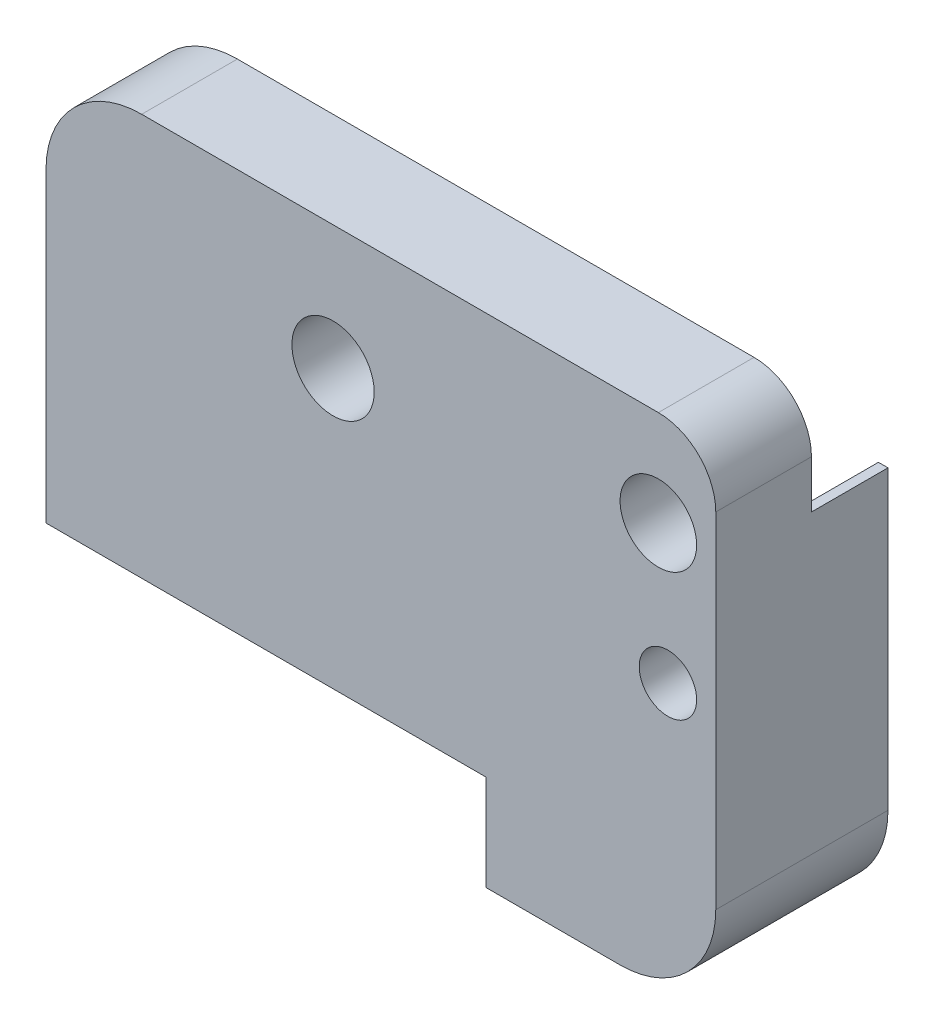
ISO-10303-21;
HEADER;
FILE_DESCRIPTION(('STEP AP214'),'2;1');
FILE_NAME('part.step','',(''),(''),'','','');
FILE_SCHEMA(('AUTOMOTIVE_DESIGN { 1 0 10303 214 1 1 1 1 }'));
ENDSEC;
DATA;
#1=APPLICATION_CONTEXT('core data for automotive mechanical design processes');
#2=APPLICATION_PROTOCOL_DEFINITION('international standard','automotive_design',2000,#1);
#3=PRODUCT_CONTEXT('',#1,'mechanical');
#4=PRODUCT('Part','Part','',(#3));
#5=PRODUCT_RELATED_PRODUCT_CATEGORY('part','',(#4));
#6=PRODUCT_DEFINITION_FORMATION('','',#4);
#7=PRODUCT_DEFINITION_CONTEXT('part definition',#1,'design');
#8=PRODUCT_DEFINITION('design','',#6,#7);
#9=PRODUCT_DEFINITION_SHAPE('','',#8);
#10=(LENGTH_UNIT() NAMED_UNIT(*) SI_UNIT(.MILLI.,.METRE.));
#11=(NAMED_UNIT(*) PLANE_ANGLE_UNIT() SI_UNIT($,.RADIAN.));
#12=(NAMED_UNIT(*) SI_UNIT($,.STERADIAN.) SOLID_ANGLE_UNIT());
#13=UNCERTAINTY_MEASURE_WITH_UNIT(LENGTH_MEASURE(1.E-05),#10,'distance_accuracy_value','');
#14=(GEOMETRIC_REPRESENTATION_CONTEXT(3) GLOBAL_UNCERTAINTY_ASSIGNED_CONTEXT((#13)) GLOBAL_UNIT_ASSIGNED_CONTEXT((#10,
#11,#12)) REPRESENTATION_CONTEXT('',''));
#15=CARTESIAN_POINT('',(0.,0.,0.));
#16=DIRECTION('',(0.,0.,1.));
#17=DIRECTION('',(1.,0.,0.));
#18=AXIS2_PLACEMENT_3D('',#15,#16,#17);
#19=CARTESIAN_POINT('',(-15.,-14.5,0.));
#20=DIRECTION('',(0.,0.,1.));
#21=DIRECTION('',(1.,0.,0.));
#22=AXIS2_PLACEMENT_3D('',#19,#20,#21);
#23=PLANE('',#22);
#24=CARTESIAN_POINT('',(17.5,-5.5,0.));
#25=DIRECTION('',(0.,0.,1.));
#26=DIRECTION('',(1.,0.,0.));
#27=AXIS2_PLACEMENT_3D('',#24,#25,#26);
#28=CIRCLE('',#27,2.);
#29=CARTESIAN_POINT('',(19.5,-5.5,0.));
#30=VERTEX_POINT('',#29);
#31=CARTESIAN_POINT('',(17.5,-7.5,0.));
#32=VERTEX_POINT('',#31);
#33=EDGE_CURVE('E208',#30,#32,#28,.F.);
#34=ORIENTED_EDGE('',*,*,#33,.T.);
#35=CARTESIAN_POINT('',(17.5,-5.5,0.));
#36=DIRECTION('',(0.,0.,1.));
#37=DIRECTION('',(1.,0.,0.));
#38=AXIS2_PLACEMENT_3D('',#35,#36,#37);
#39=CIRCLE('',#38,2.);
#40=CARTESIAN_POINT('',(15.5,-5.5,0.));
#41=VERTEX_POINT('',#40);
#42=EDGE_CURVE('E210',#32,#41,#39,.F.);
#43=ORIENTED_EDGE('',*,*,#42,.T.);
#44=DIRECTION('',(0.,1.,0.));
#45=VECTOR('',#44,1.);
#46=CARTESIAN_POINT('',(15.5,-7.5,0.));
#47=LINE('',#46,#45);
#48=CARTESIAN_POINT('',(15.5,-0.949192546583853,0.));
#49=VERTEX_POINT('',#48);
#50=EDGE_CURVE('E220',#41,#49,#47,.T.);
#51=ORIENTED_EDGE('',*,*,#50,.T.);
#52=DIRECTION('',(0.8001192566292,0.599840958230711,0.));
#53=VECTOR('',#52,1.);
#54=CARTESIAN_POINT('',(18.1,1.,0.));
#55=LINE('',#54,#53);
#56=CARTESIAN_POINT('',(2.,-11.07,0.));
#57=VERTEX_POINT('',#56);
#58=EDGE_CURVE('E190',#57,#49,#55,.T.);
#59=ORIENTED_EDGE('',*,*,#58,.F.);
#60=DIRECTION('',(0.,1.,0.));
#61=VECTOR('',#60,1.);
#62=CARTESIAN_POINT('',(2.,-11.07,0.));
#63=LINE('',#62,#61);
#64=CARTESIAN_POINT('',(2.,-14.5,0.));
#65=VERTEX_POINT('',#64);
#66=EDGE_CURVE('E194',#65,#57,#63,.T.);
#67=ORIENTED_EDGE('',*,*,#66,.F.);
#68=DIRECTION('',(1.,0.,0.));
#69=VECTOR('',#68,1.);
#70=CARTESIAN_POINT('',(-15.,-14.5,0.));
#71=LINE('',#70,#69);
#72=CARTESIAN_POINT('',(-15.,-14.5,0.));
#73=VERTEX_POINT('',#72);
#74=EDGE_CURVE('E256',#73,#65,#71,.T.);
#75=ORIENTED_EDGE('',*,*,#74,.F.);
#76=DIRECTION('',(0.,-1.,0.));
#77=VECTOR('',#76,1.);
#78=CARTESIAN_POINT('',(-15.,6.5,0.));
#79=LINE('',#78,#77);
#80=CARTESIAN_POINT('',(-15.,1.5,0.));
#81=VERTEX_POINT('',#80);
#82=EDGE_CURVE('E265',#81,#73,#79,.T.);
#83=ORIENTED_EDGE('',*,*,#82,.F.);
#84=CARTESIAN_POINT('',(-10.,1.5,0.));
#85=DIRECTION('',(0.,0.,1.));
#86=DIRECTION('',(1.,0.,0.));
#87=AXIS2_PLACEMENT_3D('',#84,#85,#86);
#88=CIRCLE('',#87,5.);
#89=CARTESIAN_POINT('',(-10.,6.5,0.));
#90=VERTEX_POINT('',#89);
#91=EDGE_CURVE('E293',#81,#90,#88,.F.);
#92=ORIENTED_EDGE('',*,*,#91,.T.);
#93=DIRECTION('',(-1.,0.,0.));
#94=VECTOR('',#93,1.);
#95=CARTESIAN_POINT('',(-15.,6.5,0.));
#96=LINE('',#95,#94);
#97=CARTESIAN_POINT('',(17.,6.5,0.));
#98=VERTEX_POINT('',#97);
#99=EDGE_CURVE('E264',#98,#90,#96,.T.);
#100=ORIENTED_EDGE('',*,*,#99,.F.);
#101=CARTESIAN_POINT('',(17.,3.5,0.));
#102=DIRECTION('',(0.,0.,1.));
#103=DIRECTION('',(1.,0.,0.));
#104=AXIS2_PLACEMENT_3D('',#101,#102,#103);
#105=CIRCLE('',#104,3.);
#106=CARTESIAN_POINT('',(20.,3.5,0.));
#107=VERTEX_POINT('',#106);
#108=EDGE_CURVE('E340',#98,#107,#105,.F.);
#109=ORIENTED_EDGE('',*,*,#108,.T.);
#110=DIRECTION('',(0.,-1.,0.));
#111=VECTOR('',#110,1.);
#112=CARTESIAN_POINT('',(20.,6.5,0.));
#113=LINE('',#112,#111);
#114=CARTESIAN_POINT('',(20.,1.,0.));
#115=VERTEX_POINT('',#114);
#116=EDGE_CURVE('E343',#107,#115,#113,.T.);
#117=ORIENTED_EDGE('',*,*,#116,.T.);
#118=DIRECTION('',(1.,0.,0.));
#119=VECTOR('',#118,1.);
#120=CARTESIAN_POINT('',(20.,1.,0.));
#121=LINE('',#120,#119);
#122=CARTESIAN_POINT('',(19.5,1.,0.));
#123=VERTEX_POINT('',#122);
#124=EDGE_CURVE('E193',#123,#115,#121,.T.);
#125=ORIENTED_EDGE('',*,*,#124,.F.);
#126=DIRECTION('',(0.,-1.,0.));
#127=VECTOR('',#126,1.);
#128=CARTESIAN_POINT('',(19.5,1.,0.));
#129=LINE('',#128,#127);
#130=EDGE_CURVE('E162',#123,#30,#129,.T.);
#131=ORIENTED_EDGE('',*,*,#130,.T.);
#132=EDGE_LOOP('',(#34,#43,#51,#59,#67,#75,#83,#92,#100,#109,#117,#125,#131));
#133=FACE_BOUND('',#132,.T.);
#134=CARTESIAN_POINT('',(-4.9,-6.5,0.));
#135=DIRECTION('',(0.,0.,-1.));
#136=DIRECTION('',(-1.,0.,0.));
#137=AXIS2_PLACEMENT_3D('',#134,#135,#136);
#138=CIRCLE('',#137,4.5);
#139=CARTESIAN_POINT('',(-9.4,-6.5,0.));
#140=VERTEX_POINT('',#139);
#141=EDGE_CURVE('E366',#140,#140,#138,.T.);
#142=ORIENTED_EDGE('',*,*,#141,.F.);
#143=EDGE_LOOP('',(#142));
#144=FACE_BOUND('',#143,.T.);
#145=CARTESIAN_POINT('',(17.5,-5.5,0.));
#146=DIRECTION('',(0.,0.,1.));
#147=DIRECTION('',(1.,0.,0.));
#148=AXIS2_PLACEMENT_3D('',#145,#146,#147);
#149=CIRCLE('',#148,1.5);
#150=CARTESIAN_POINT('',(19.,-5.5,0.));
#151=VERTEX_POINT('',#150);
#152=EDGE_CURVE('E166',#151,#151,#149,.F.);
#153=ORIENTED_EDGE('',*,*,#152,.F.);
#154=EDGE_LOOP('',(#153));
#155=FACE_BOUND('',#154,.T.);
#156=ADVANCED_FACE('F36',(#133,#144,#155),#23,.F.);
#157=CARTESIAN_POINT('',(-15.,6.5,5.));
#158=DIRECTION('',(1.,0.,0.));
#159=DIRECTION('',(0.,1.,0.));
#160=AXIS2_PLACEMENT_3D('',#157,#158,#159);
#161=PLANE('',#160);
#162=DIRECTION('',(0.,-1.,0.));
#163=VECTOR('',#162,1.);
#164=CARTESIAN_POINT('',(-15.,6.5,5.));
#165=LINE('',#164,#163);
#166=CARTESIAN_POINT('',(-15.,1.5,5.));
#167=VERTEX_POINT('',#166);
#168=CARTESIAN_POINT('',(-15.,-14.5,5.));
#169=VERTEX_POINT('',#168);
#170=EDGE_CURVE('E318',#167,#169,#165,.T.);
#171=ORIENTED_EDGE('',*,*,#170,.F.);
#172=DIRECTION('',(0.,0.,-1.));
#173=VECTOR('',#172,1.);
#174=CARTESIAN_POINT('',(-15.,1.5,5.));
#175=LINE('',#174,#173);
#176=EDGE_CURVE('E291',#167,#81,#175,.T.);
#177=ORIENTED_EDGE('',*,*,#176,.T.);
#178=ORIENTED_EDGE('',*,*,#82,.T.);
#179=DIRECTION('',(0.,0.,-1.));
#180=VECTOR('',#179,1.);
#181=CARTESIAN_POINT('',(-15.,-14.5,5.));
#182=LINE('',#181,#180);
#183=EDGE_CURVE('E263',#169,#73,#182,.T.);
#184=ORIENTED_EDGE('',*,*,#183,.F.);
#185=EDGE_LOOP('',(#171,#177,#178,#184));
#186=FACE_BOUND('',#185,.T.);
#187=ADVANCED_FACE('F317',(#186),#161,.F.);
#188=CARTESIAN_POINT('',(-15.,-14.5,5.));
#189=DIRECTION('',(0.,1.,0.));
#190=DIRECTION('',(0.,0.,1.));
#191=AXIS2_PLACEMENT_3D('',#188,#189,#190);
#192=PLANE('',#191);
#193=CARTESIAN_POINT('',(1.40000000000001,-14.5,2.5));
#194=DIRECTION('',(0.,-1.,0.));
#195=DIRECTION('',(0.,0.,-1.));
#196=AXIS2_PLACEMENT_3D('',#193,#194,#195);
#197=CIRCLE('',#196,1.25);
#198=CARTESIAN_POINT('',(1.40000000000001,-14.5,1.25));
#199=VERTEX_POINT('',#198);
#200=EDGE_CURVE('E345',#199,#199,#197,.T.);
#201=ORIENTED_EDGE('',*,*,#200,.F.);
#202=EDGE_LOOP('',(#201));
#203=FACE_BOUND('',#202,.T.);
#204=CARTESIAN_POINT('',(-12.,-14.5,2.5));
#205=DIRECTION('',(0.,-1.,0.));
#206=DIRECTION('',(0.,0.,-1.));
#207=AXIS2_PLACEMENT_3D('',#204,#205,#206);
#208=CIRCLE('',#207,1.25);
#209=CARTESIAN_POINT('',(-12.,-14.5,1.25));
#210=VERTEX_POINT('',#209);
#211=EDGE_CURVE('E363',#210,#210,#208,.T.);
#212=ORIENTED_EDGE('',*,*,#211,.F.);
#213=EDGE_LOOP('',(#212));
#214=FACE_BOUND('',#213,.T.);
#215=ORIENTED_EDGE('',*,*,#74,.T.);
#216=DIRECTION('',(0.,0.,1.));
#217=VECTOR('',#216,1.);
#218=CARTESIAN_POINT('',(2.,-14.5,-4.));
#219=LINE('',#218,#217);
#220=CARTESIAN_POINT('',(2.,-14.5,-4.));
#221=VERTEX_POINT('',#220);
#222=EDGE_CURVE('E251',#221,#65,#219,.T.);
#223=ORIENTED_EDGE('',*,*,#222,.F.);
#224=DIRECTION('',(-1.,0.,0.));
#225=VECTOR('',#224,1.);
#226=CARTESIAN_POINT('',(2.,-14.5,-4.));
#227=LINE('',#226,#225);
#228=CARTESIAN_POINT('',(8.,-14.5,-4.));
#229=VERTEX_POINT('',#228);
#230=EDGE_CURVE('E239',#229,#221,#227,.T.);
#231=ORIENTED_EDGE('',*,*,#230,.F.);
#232=DIRECTION('',(0.,0.,-1.));
#233=VECTOR('',#232,1.);
#234=CARTESIAN_POINT('',(8.00000000000001,-14.5,5.));
#235=LINE('',#234,#233);
#236=CARTESIAN_POINT('',(8.00000000000001,-14.5,5.));
#237=VERTEX_POINT('',#236);
#238=EDGE_CURVE('E311',#237,#229,#235,.T.);
#239=ORIENTED_EDGE('',*,*,#238,.F.);
#240=DIRECTION('',(1.,0.,0.));
#241=VECTOR('',#240,1.);
#242=CARTESIAN_POINT('',(-15.,-14.5,5.));
#243=LINE('',#242,#241);
#244=EDGE_CURVE('E312',#169,#237,#243,.T.);
#245=ORIENTED_EDGE('',*,*,#244,.F.);
#246=ORIENTED_EDGE('',*,*,#183,.T.);
#247=EDGE_LOOP('',(#215,#223,#231,#239,#245,#246));
#248=FACE_BOUND('',#247,.T.);
#249=ADVANCED_FACE('F260',(#203,#214,#248),#192,.F.);
#250=CARTESIAN_POINT('',(-15.,6.5,5.));
#251=DIRECTION('',(0.,-1.,0.));
#252=DIRECTION('',(0.,0.,-1.));
#253=AXIS2_PLACEMENT_3D('',#250,#251,#252);
#254=PLANE('',#253);
#255=ORIENTED_EDGE('',*,*,#99,.T.);
#256=DIRECTION('',(0.,0.,-1.));
#257=VECTOR('',#256,1.);
#258=CARTESIAN_POINT('',(-10.,6.5,5.));
#259=LINE('',#258,#257);
#260=CARTESIAN_POINT('',(-10.,6.5,5.));
#261=VERTEX_POINT('',#260);
#262=EDGE_CURVE('E203',#90,#261,#259,.F.);
#263=ORIENTED_EDGE('',*,*,#262,.T.);
#264=DIRECTION('',(-1.,0.,0.));
#265=VECTOR('',#264,1.);
#266=CARTESIAN_POINT('',(-15.,6.5,5.));
#267=LINE('',#266,#265);
#268=CARTESIAN_POINT('',(17.,6.5,5.));
#269=VERTEX_POINT('',#268);
#270=EDGE_CURVE('E301',#269,#261,#267,.T.);
#271=ORIENTED_EDGE('',*,*,#270,.F.);
#272=DIRECTION('',(0.,0.,1.));
#273=VECTOR('',#272,1.);
#274=CARTESIAN_POINT('',(17.,6.5,0.));
#275=LINE('',#274,#273);
#276=EDGE_CURVE('E283',#269,#98,#275,.F.);
#277=ORIENTED_EDGE('',*,*,#276,.T.);
#278=EDGE_LOOP('',(#255,#263,#271,#277));
#279=FACE_BOUND('',#278,.T.);
#280=ADVANCED_FACE('F300',(#279),#254,.F.);
#281=CARTESIAN_POINT('',(-15.,-14.5,5.));
#282=DIRECTION('',(0.,0.,1.));
#283=DIRECTION('',(1.,0.,0.));
#284=AXIS2_PLACEMENT_3D('',#281,#282,#283);
#285=PLANE('',#284);
#286=CARTESIAN_POINT('',(17.5,-5.5,5.));
#287=DIRECTION('',(0.,0.,1.));
#288=DIRECTION('',(1.,0.,0.));
#289=AXIS2_PLACEMENT_3D('',#286,#287,#288);
#290=CIRCLE('',#289,1.5);
#291=CARTESIAN_POINT('',(19.,-5.5,5.));
#292=VERTEX_POINT('',#291);
#293=EDGE_CURVE('E469',#292,#292,#290,.T.);
#294=ORIENTED_EDGE('',*,*,#293,.F.);
#295=EDGE_LOOP('',(#294));
#296=FACE_BOUND('',#295,.T.);
#297=CARTESIAN_POINT('',(17.,1.5,5.));
#298=DIRECTION('',(0.,0.,1.));
#299=DIRECTION('',(1.,0.,0.));
#300=AXIS2_PLACEMENT_3D('',#297,#298,#299);
#301=CIRCLE('',#300,2.);
#302=CARTESIAN_POINT('',(19.,1.5,5.));
#303=VERTEX_POINT('',#302);
#304=EDGE_CURVE('E350',#303,#303,#301,.T.);
#305=ORIENTED_EDGE('',*,*,#304,.F.);
#306=EDGE_LOOP('',(#305));
#307=FACE_BOUND('',#306,.T.);
#308=CARTESIAN_POINT('',(0.,0.,5.));
#309=DIRECTION('',(0.,0.,1.));
#310=DIRECTION('',(1.,0.,0.));
#311=AXIS2_PLACEMENT_3D('',#308,#309,#310);
#312=CIRCLE('',#311,2.15);
#313=CARTESIAN_POINT('',(2.15,0.,5.));
#314=VERTEX_POINT('',#313);
#315=EDGE_CURVE('E322',#314,#314,#312,.T.);
#316=ORIENTED_EDGE('',*,*,#315,.F.);
#317=EDGE_LOOP('',(#316));
#318=FACE_BOUND('',#317,.T.);
#319=DIRECTION('',(1.,0.,0.));
#320=VECTOR('',#319,1.);
#321=CARTESIAN_POINT('',(8.,-19.5,5.));
#322=LINE('',#321,#320);
#323=CARTESIAN_POINT('',(8.,-19.5,5.));
#324=VERTEX_POINT('',#323);
#325=CARTESIAN_POINT('',(15.,-19.5,5.));
#326=VERTEX_POINT('',#325);
#327=EDGE_CURVE('E354',#324,#326,#322,.T.);
#328=ORIENTED_EDGE('',*,*,#327,.T.);
#329=CARTESIAN_POINT('',(15.,-14.5,5.));
#330=DIRECTION('',(0.,0.,1.));
#331=DIRECTION('',(1.,0.,0.));
#332=AXIS2_PLACEMENT_3D('',#329,#330,#331);
#333=CIRCLE('',#332,5.);
#334=CARTESIAN_POINT('',(20.,-14.5,5.));
#335=VERTEX_POINT('',#334);
#336=EDGE_CURVE('E285',#326,#335,#333,.T.);
#337=ORIENTED_EDGE('',*,*,#336,.T.);
#338=DIRECTION('',(0.,1.,0.));
#339=VECTOR('',#338,1.);
#340=CARTESIAN_POINT('',(20.,6.5,5.));
#341=LINE('',#340,#339);
#342=CARTESIAN_POINT('',(20.,3.5,5.));
#343=VERTEX_POINT('',#342);
#344=EDGE_CURVE('E383',#335,#343,#341,.T.);
#345=ORIENTED_EDGE('',*,*,#344,.T.);
#346=CARTESIAN_POINT('',(17.,3.5,5.));
#347=DIRECTION('',(0.,0.,1.));
#348=DIRECTION('',(1.,0.,0.));
#349=AXIS2_PLACEMENT_3D('',#346,#347,#348);
#350=CIRCLE('',#349,3.);
#351=EDGE_CURVE('E310',#343,#269,#350,.T.);
#352=ORIENTED_EDGE('',*,*,#351,.T.);
#353=ORIENTED_EDGE('',*,*,#270,.T.);
#354=CARTESIAN_POINT('',(-10.,1.5,5.));
#355=DIRECTION('',(0.,0.,1.));
#356=DIRECTION('',(1.,0.,0.));
#357=AXIS2_PLACEMENT_3D('',#354,#355,#356);
#358=CIRCLE('',#357,5.);
#359=EDGE_CURVE('E282',#261,#167,#358,.T.);
#360=ORIENTED_EDGE('',*,*,#359,.T.);
#361=ORIENTED_EDGE('',*,*,#170,.T.);
#362=ORIENTED_EDGE('',*,*,#244,.T.);
#363=DIRECTION('',(0.,-1.,0.));
#364=VECTOR('',#363,1.);
#365=CARTESIAN_POINT('',(8.,6.5,5.));
#366=LINE('',#365,#364);
#367=EDGE_CURVE('E357',#237,#324,#366,.T.);
#368=ORIENTED_EDGE('',*,*,#367,.T.);
#369=EDGE_LOOP('',(#328,#337,#345,#352,#353,#360,#361,#362,#368));
#370=FACE_BOUND('',#369,.T.);
#371=ADVANCED_FACE('F307',(#296,#307,#318,#370),#285,.T.);
#372=CARTESIAN_POINT('',(0.,0.,0.7));
#373=DIRECTION('',(0.,0.,1.));
#374=DIRECTION('',(1.,0.,0.));
#375=AXIS2_PLACEMENT_3D('',#372,#373,#374);
#376=CYLINDRICAL_SURFACE('',#375,2.15);
#377=CARTESIAN_POINT('',(0.,0.,0.7));
#378=DIRECTION('',(0.,0.,1.));
#379=DIRECTION('',(1.,0.,0.));
#380=AXIS2_PLACEMENT_3D('',#377,#378,#379);
#381=CIRCLE('',#380,2.15);
#382=CARTESIAN_POINT('',(2.15,0.,0.7));
#383=VERTEX_POINT('',#382);
#384=EDGE_CURVE('E319',#383,#383,#381,.T.);
#385=CARTESIAN_POINT('',(2.15,0.,0.7));
#386=CARTESIAN_POINT('',(2.15,0.,0.744791666666667));
#387=CARTESIAN_POINT('',(2.15,0.,0.789583333333333));
#388=CARTESIAN_POINT('',(2.15,0.,0.879166666666667));
#389=CARTESIAN_POINT('',(2.15,0.,0.923958333333333));
#390=CARTESIAN_POINT('',(2.15,0.,1.01354166666667));
#391=CARTESIAN_POINT('',(2.15,0.,1.05833333333333));
#392=CARTESIAN_POINT('',(2.15,0.,1.14791666666667));
#393=CARTESIAN_POINT('',(2.15,0.,1.19270833333333));
#394=CARTESIAN_POINT('',(2.15,0.,1.28229166666667));
#395=CARTESIAN_POINT('',(2.15,0.,1.32708333333333));
#396=CARTESIAN_POINT('',(2.15,0.,1.41666666666667));
#397=CARTESIAN_POINT('',(2.15,0.,1.46145833333333));
#398=CARTESIAN_POINT('',(2.15,0.,1.55104166666667));
#399=CARTESIAN_POINT('',(2.15,0.,1.59583333333333));
#400=CARTESIAN_POINT('',(2.15,0.,1.68541666666667));
#401=CARTESIAN_POINT('',(2.15,0.,1.73020833333333));
#402=CARTESIAN_POINT('',(2.15,0.,1.81979166666667));
#403=CARTESIAN_POINT('',(2.15,0.,1.86458333333333));
#404=CARTESIAN_POINT('',(2.15,0.,1.95416666666667));
#405=CARTESIAN_POINT('',(2.15,0.,1.99895833333333));
#406=CARTESIAN_POINT('',(2.15,0.,2.08854166666667));
#407=CARTESIAN_POINT('',(2.15,0.,2.13333333333333));
#408=CARTESIAN_POINT('',(2.15,0.,2.22291666666667));
#409=CARTESIAN_POINT('',(2.15,0.,2.26770833333333));
#410=CARTESIAN_POINT('',(2.15,0.,2.35729166666667));
#411=CARTESIAN_POINT('',(2.15,0.,2.40208333333333));
#412=CARTESIAN_POINT('',(2.15,0.,2.49166666666667));
#413=CARTESIAN_POINT('',(2.15,0.,2.53645833333333));
#414=CARTESIAN_POINT('',(2.15,0.,2.62604166666667));
#415=CARTESIAN_POINT('',(2.15,0.,2.67083333333333));
#416=CARTESIAN_POINT('',(2.15,0.,2.76041666666667));
#417=CARTESIAN_POINT('',(2.15,0.,2.80520833333333));
#418=CARTESIAN_POINT('',(2.15,0.,2.89479166666667));
#419=CARTESIAN_POINT('',(2.15,0.,2.93958333333333));
#420=CARTESIAN_POINT('',(2.15,0.,3.02916666666667));
#421=CARTESIAN_POINT('',(2.15,0.,3.07395833333333));
#422=CARTESIAN_POINT('',(2.15,0.,3.16354166666667));
#423=CARTESIAN_POINT('',(2.15,0.,3.20833333333333));
#424=CARTESIAN_POINT('',(2.15,0.,3.29791666666667));
#425=CARTESIAN_POINT('',(2.15,0.,3.34270833333333));
#426=CARTESIAN_POINT('',(2.15,0.,3.43229166666667));
#427=CARTESIAN_POINT('',(2.15,0.,3.47708333333333));
#428=CARTESIAN_POINT('',(2.15,0.,3.56666666666667));
#429=CARTESIAN_POINT('',(2.15,0.,3.61145833333333));
#430=CARTESIAN_POINT('',(2.15,0.,3.70104166666667));
#431=CARTESIAN_POINT('',(2.15,0.,3.74583333333333));
#432=CARTESIAN_POINT('',(2.15,0.,3.83541666666667));
#433=CARTESIAN_POINT('',(2.15,0.,3.88020833333333));
#434=CARTESIAN_POINT('',(2.15,0.,3.96979166666667));
#435=CARTESIAN_POINT('',(2.15,0.,4.01458333333333));
#436=CARTESIAN_POINT('',(2.15,0.,4.10416666666667));
#437=CARTESIAN_POINT('',(2.15,0.,4.14895833333333));
#438=CARTESIAN_POINT('',(2.15,0.,4.23854166666667));
#439=CARTESIAN_POINT('',(2.15,0.,4.28333333333333));
#440=CARTESIAN_POINT('',(2.15,0.,4.37291666666667));
#441=CARTESIAN_POINT('',(2.15,0.,4.41770833333333));
#442=CARTESIAN_POINT('',(2.15,0.,4.50729166666667));
#443=CARTESIAN_POINT('',(2.15,0.,4.55208333333333));
#444=CARTESIAN_POINT('',(2.15,0.,4.64166666666667));
#445=CARTESIAN_POINT('',(2.15,0.,4.68645833333333));
#446=CARTESIAN_POINT('',(2.15,0.,4.77604166666667));
#447=CARTESIAN_POINT('',(2.15,0.,4.82083333333333));
#448=CARTESIAN_POINT('',(2.15,0.,4.91041666666667));
#449=CARTESIAN_POINT('',(2.15,0.,4.95520833333333));
#450=CARTESIAN_POINT('',(2.15,0.,5.));
#451=B_SPLINE_CURVE_WITH_KNOTS('',3,(#385,#386,#387,#388,#389,#390,#391,#392,#393,#394,#395,
#396,#397,#398,#399,#400,#401,#402,#403,#404,#405,#406,#407,#408,#409,#410,#411,#412,#413,#414,
#415,#416,#417,#418,#419,#420,#421,#422,#423,#424,#425,#426,#427,#428,#429,#430,#431,#432,#433,
#434,#435,#436,#437,#438,#439,#440,#441,#442,#443,#444,#445,#446,#447,#448,#449,#450),
.UNSPECIFIED.,.F.,.F.,(4,2,2,2,2,2,2,2,2,2,2,2,2,2,2,2,2,2,2,2,2,2,2,2,2,2,2,2,2,2,2,2,4),(0.,
0.134375,0.26875,0.403125,0.5375,0.671875,0.80625,0.940625,1.075,1.209375,1.34375,1.478125,
1.6125,1.746875,1.88125,2.015625,2.15,2.284375,2.41875,2.553125,2.6875,2.821875,2.95625,
3.090625,3.225,3.359375,3.49375,3.628125,3.7625,3.896875,4.03125,4.165625,4.3),.UNSPECIFIED.);
#452=EDGE_CURVE('BSEAM503',#383,#314,#451,.T.);
#453=ORIENTED_EDGE('',*,*,#384,.F.);
#454=ORIENTED_EDGE('',*,*,#315,.T.);
#455=ORIENTED_EDGE('',*,*,#452,.T.);
#456=ORIENTED_EDGE('',*,*,#452,.F.);
#457=EDGE_LOOP('',(#453,#455,#454,#456));
#458=FACE_BOUND('',#457,.T.);
#459=ADVANCED_FACE('F503',(#458),#376,.F.);
#460=CARTESIAN_POINT('',(0.,0.,0.7));
#461=DIRECTION('',(0.,0.,1.));
#462=DIRECTION('',(1.,0.,0.));
#463=AXIS2_PLACEMENT_3D('',#460,#461,#462);
#464=PLANE('',#463);
#465=ORIENTED_EDGE('',*,*,#384,.T.);
#466=EDGE_LOOP('',(#465));
#467=FACE_BOUND('',#466,.T.);
#468=ADVANCED_FACE('F500',(#467),#464,.T.);
#469=CARTESIAN_POINT('',(-4.9,-6.5,4.5));
#470=DIRECTION('',(0.,0.,-1.));
#471=DIRECTION('',(-1.,0.,0.));
#472=AXIS2_PLACEMENT_3D('',#469,#470,#471);
#473=CYLINDRICAL_SURFACE('',#472,4.5);
#474=CARTESIAN_POINT('',(-4.9,-6.5,4.5));
#475=DIRECTION('',(0.,0.,-1.));
#476=DIRECTION('',(-1.,0.,0.));
#477=AXIS2_PLACEMENT_3D('',#474,#475,#476);
#478=CIRCLE('',#477,4.5);
#479=CARTESIAN_POINT('',(-9.4,-6.5,4.5));
#480=VERTEX_POINT('',#479);
#481=EDGE_CURVE('E367',#480,#480,#478,.T.);
#482=ORIENTED_EDGE('',*,*,#481,.F.);
#483=EDGE_LOOP('',(#482));
#484=FACE_BOUND('',#483,.T.);
#485=ORIENTED_EDGE('',*,*,#141,.T.);
#486=EDGE_LOOP('',(#485));
#487=FACE_BOUND('',#486,.T.);
#488=ADVANCED_FACE('F493',(#484,#487),#473,.F.);
#489=CARTESIAN_POINT('',(-4.9,-6.5,4.5));
#490=DIRECTION('',(0.,0.,-1.));
#491=DIRECTION('',(-1.,0.,0.));
#492=AXIS2_PLACEMENT_3D('',#489,#490,#491);
#493=PLANE('',#492);
#494=ORIENTED_EDGE('',*,*,#481,.T.);
#495=EDGE_LOOP('',(#494));
#496=FACE_BOUND('',#495,.T.);
#497=ADVANCED_FACE('F487',(#496),#493,.T.);
#498=CARTESIAN_POINT('',(-12.,-6.5,2.5));
#499=DIRECTION('',(0.,-1.,0.));
#500=DIRECTION('',(0.,0.,-1.));
#501=AXIS2_PLACEMENT_3D('',#498,#499,#500);
#502=CYLINDRICAL_SURFACE('',#501,1.25);
#503=CARTESIAN_POINT('',(-12.,-6.50000000000001,2.5));
#504=DIRECTION('',(0.,-1.,0.));
#505=DIRECTION('',(0.,0.,-1.));
#506=AXIS2_PLACEMENT_3D('',#503,#504,#505);
#507=CIRCLE('',#506,1.24999999999999);
#508=CARTESIAN_POINT('',(-12.,-6.50000000000001,1.25000000000001));
#509=VERTEX_POINT('',#508);
#510=EDGE_CURVE('E267',#509,#509,#507,.T.);
#511=ORIENTED_EDGE('',*,*,#510,.F.);
#512=EDGE_LOOP('',(#511));
#513=FACE_BOUND('',#512,.T.);
#514=ORIENTED_EDGE('',*,*,#211,.T.);
#515=EDGE_LOOP('',(#514));
#516=FACE_BOUND('',#515,.T.);
#517=ADVANCED_FACE('F480',(#513,#516),#502,.F.);
#518=CARTESIAN_POINT('',(1.40000000000001,-6.5,2.5));
#519=DIRECTION('',(0.,-1.,0.));
#520=DIRECTION('',(0.,0.,-1.));
#521=AXIS2_PLACEMENT_3D('',#518,#519,#520);
#522=CYLINDRICAL_SURFACE('',#521,1.25);
#523=CARTESIAN_POINT('',(1.40000000000001,-6.50000000000001,2.5));
#524=DIRECTION('',(0.,-1.,0.));
#525=DIRECTION('',(0.,0.,-1.));
#526=AXIS2_PLACEMENT_3D('',#523,#524,#525);
#527=CIRCLE('',#526,1.24999999999999);
#528=CARTESIAN_POINT('',(1.40000000000001,-6.50000000000001,1.25000000000001));
#529=VERTEX_POINT('',#528);
#530=EDGE_CURVE('E270',#529,#529,#527,.T.);
#531=ORIENTED_EDGE('',*,*,#530,.F.);
#532=EDGE_LOOP('',(#531));
#533=FACE_BOUND('',#532,.T.);
#534=ORIENTED_EDGE('',*,*,#200,.T.);
#535=EDGE_LOOP('',(#534));
#536=FACE_BOUND('',#535,.T.);
#537=ADVANCED_FACE('F477',(#533,#536),#522,.F.);
#538=CARTESIAN_POINT('',(8.,6.5,-28.6356421265527));
#539=DIRECTION('',(-1.,0.,0.));
#540=DIRECTION('',(0.,-1.,0.));
#541=AXIS2_PLACEMENT_3D('',#538,#539,#540);
#542=PLANE('',#541);
#543=ORIENTED_EDGE('',*,*,#367,.F.);
#544=ORIENTED_EDGE('',*,*,#238,.T.);
#545=DIRECTION('',(0.,1.,0.));
#546=VECTOR('',#545,1.);
#547=CARTESIAN_POINT('',(8.,-14.5,-4.));
#548=LINE('',#547,#546);
#549=CARTESIAN_POINT('',(8.,-19.5,-4.));
#550=VERTEX_POINT('',#549);
#551=EDGE_CURVE('E202',#550,#229,#548,.T.);
#552=ORIENTED_EDGE('',*,*,#551,.F.);
#553=DIRECTION('',(0.,0.,1.));
#554=VECTOR('',#553,1.);
#555=CARTESIAN_POINT('',(8.,-19.5,-28.6356421265527));
#556=LINE('',#555,#554);
#557=EDGE_CURVE('E346',#550,#324,#556,.T.);
#558=ORIENTED_EDGE('',*,*,#557,.T.);
#559=EDGE_LOOP('',(#543,#544,#552,#558));
#560=FACE_BOUND('',#559,.T.);
#561=ADVANCED_FACE('F378',(#560),#542,.T.);
#562=CARTESIAN_POINT('',(20.,6.5,-28.6356421265527));
#563=DIRECTION('',(1.,0.,0.));
#564=DIRECTION('',(0.,1.,0.));
#565=AXIS2_PLACEMENT_3D('',#562,#563,#564);
#566=PLANE('',#565);
#567=ORIENTED_EDGE('',*,*,#344,.F.);
#568=DIRECTION('',(0.,0.,1.));
#569=VECTOR('',#568,1.);
#570=CARTESIAN_POINT('',(20.,-14.5,-28.6356421265527));
#571=LINE('',#570,#569);
#572=CARTESIAN_POINT('',(20.,-14.5,-4.));
#573=VERTEX_POINT('',#572);
#574=EDGE_CURVE('E287',#335,#573,#571,.F.);
#575=ORIENTED_EDGE('',*,*,#574,.T.);
#576=DIRECTION('',(0.,-1.,0.));
#577=VECTOR('',#576,1.);
#578=CARTESIAN_POINT('',(20.,-19.5,-4.));
#579=LINE('',#578,#577);
#580=CARTESIAN_POINT('',(20.,1.,-4.));
#581=VERTEX_POINT('',#580);
#582=EDGE_CURVE('E179',#581,#573,#579,.T.);
#583=ORIENTED_EDGE('',*,*,#582,.F.);
#584=DIRECTION('',(0.,0.,1.));
#585=VECTOR('',#584,1.);
#586=CARTESIAN_POINT('',(20.,1.,-4.));
#587=LINE('',#586,#585);
#588=EDGE_CURVE('E177',#581,#115,#587,.T.);
#589=ORIENTED_EDGE('',*,*,#588,.T.);
#590=ORIENTED_EDGE('',*,*,#116,.F.);
#591=DIRECTION('',(0.,0.,1.));
#592=VECTOR('',#591,1.);
#593=CARTESIAN_POINT('',(20.,3.5,5.));
#594=LINE('',#593,#592);
#595=EDGE_CURVE('E337',#107,#343,#594,.T.);
#596=ORIENTED_EDGE('',*,*,#595,.T.);
#597=EDGE_LOOP('',(#567,#575,#583,#589,#590,#596));
#598=FACE_BOUND('',#597,.T.);
#599=ADVANCED_FACE('F391',(#598),#566,.T.);
#600=CARTESIAN_POINT('',(8.,-19.5,-28.6356421265527));
#601=DIRECTION('',(0.,-1.,0.));
#602=DIRECTION('',(0.,0.,-1.));
#603=AXIS2_PLACEMENT_3D('',#600,#601,#602);
#604=PLANE('',#603);
#605=DIRECTION('',(-1.,0.,0.));
#606=VECTOR('',#605,1.);
#607=CARTESIAN_POINT('',(8.,-19.5,-4.));
#608=LINE('',#607,#606);
#609=CARTESIAN_POINT('',(15.,-19.5,-4.));
#610=VERTEX_POINT('',#609);
#611=EDGE_CURVE('E182',#610,#550,#608,.T.);
#612=ORIENTED_EDGE('',*,*,#611,.F.);
#613=DIRECTION('',(0.,0.,1.));
#614=VECTOR('',#613,1.);
#615=CARTESIAN_POINT('',(15.,-19.5,-28.6356421265527));
#616=LINE('',#615,#614);
#617=EDGE_CURVE('E279',#610,#326,#616,.T.);
#618=ORIENTED_EDGE('',*,*,#617,.T.);
#619=ORIENTED_EDGE('',*,*,#327,.F.);
#620=ORIENTED_EDGE('',*,*,#557,.F.);
#621=EDGE_LOOP('',(#612,#618,#619,#620));
#622=FACE_BOUND('',#621,.T.);
#623=ADVANCED_FACE('F397',(#622),#604,.T.);
#624=CARTESIAN_POINT('',(17.,1.5,1.));
#625=DIRECTION('',(0.,0.,1.));
#626=DIRECTION('',(1.,0.,0.));
#627=AXIS2_PLACEMENT_3D('',#624,#625,#626);
#628=CYLINDRICAL_SURFACE('',#627,2.);
#629=CARTESIAN_POINT('',(17.,1.5,1.));
#630=DIRECTION('',(0.,0.,1.));
#631=DIRECTION('',(1.,0.,0.));
#632=AXIS2_PLACEMENT_3D('',#629,#630,#631);
#633=CIRCLE('',#632,2.);
#634=CARTESIAN_POINT('',(19.,1.5,1.));
#635=VERTEX_POINT('',#634);
#636=EDGE_CURVE('E360',#635,#635,#633,.T.);
#637=ORIENTED_EDGE('',*,*,#636,.F.);
#638=EDGE_LOOP('',(#637));
#639=FACE_BOUND('',#638,.T.);
#640=ORIENTED_EDGE('',*,*,#304,.T.);
#641=EDGE_LOOP('',(#640));
#642=FACE_BOUND('',#641,.T.);
#643=ADVANCED_FACE('F399',(#639,#642),#628,.F.);
#644=CARTESIAN_POINT('',(17.,1.5,1.));
#645=DIRECTION('',(0.,0.,1.));
#646=DIRECTION('',(1.,0.,0.));
#647=AXIS2_PLACEMENT_3D('',#644,#645,#646);
#648=PLANE('',#647);
#649=ORIENTED_EDGE('',*,*,#636,.T.);
#650=EDGE_LOOP('',(#649));
#651=FACE_BOUND('',#650,.T.);
#652=ADVANCED_FACE('F405',(#651),#648,.T.);
#653=CARTESIAN_POINT('',(17.5,-5.5,-4.24264068711929));
#654=DIRECTION('',(0.,0.,1.));
#655=DIRECTION('',(1.,0.,0.));
#656=AXIS2_PLACEMENT_3D('',#653,#654,#655);
#657=CYLINDRICAL_SURFACE('',#656,1.5);
#658=ORIENTED_EDGE('',*,*,#152,.T.);
#659=EDGE_LOOP('',(#658));
#660=FACE_BOUND('',#659,.T.);
#661=ORIENTED_EDGE('',*,*,#293,.T.);
#662=EDGE_LOOP('',(#661));
#663=FACE_BOUND('',#662,.T.);
#664=ADVANCED_FACE('F427',(#660,#663),#657,.F.);
#665=CARTESIAN_POINT('',(17.,3.5,-28.6356421265527));
#666=DIRECTION('',(0.,0.,-1.));
#667=DIRECTION('',(-1.,0.,0.));
#668=AXIS2_PLACEMENT_3D('',#665,#666,#667);
#669=CYLINDRICAL_SURFACE('',#668,3.);
#670=ORIENTED_EDGE('',*,*,#108,.F.);
#671=ORIENTED_EDGE('',*,*,#276,.F.);
#672=ORIENTED_EDGE('',*,*,#351,.F.);
#673=ORIENTED_EDGE('',*,*,#595,.F.);
#674=EDGE_LOOP('',(#670,#671,#672,#673));
#675=FACE_BOUND('',#674,.T.);
#676=ADVANCED_FACE('F389',(#675),#669,.T.);
#677=CARTESIAN_POINT('',(1.40000000000001,-6.50000000000001,2.5));
#678=DIRECTION('',(0.,-1.,0.));
#679=DIRECTION('',(0.,0.,-1.));
#680=AXIS2_PLACEMENT_3D('',#677,#678,#679);
#681=CONICAL_SURFACE('',#680,1.24999999999999,1.02974425867664);
#682=CARTESIAN_POINT('',(1.4,-5.74892422621555,2.5));
#683=VERTEX_POINT('',#682);
#684=VERTEX_LOOP('',#683);
#685=FACE_BOUND('',#684,.T.);
#686=ORIENTED_EDGE('',*,*,#530,.T.);
#687=EDGE_LOOP('',(#686));
#688=FACE_BOUND('',#687,.T.);
#689=ADVANCED_FACE('F426',(#685,#688),#681,.F.);
#690=CARTESIAN_POINT('',(-12.,-6.50000000000001,2.5));
#691=DIRECTION('',(0.,-1.,0.));
#692=DIRECTION('',(0.,0.,-1.));
#693=AXIS2_PLACEMENT_3D('',#690,#691,#692);
#694=CONICAL_SURFACE('',#693,1.24999999999999,1.02974425867664);
#695=CARTESIAN_POINT('',(-12.,-5.74892422621555,2.5));
#696=VERTEX_POINT('',#695);
#697=VERTEX_LOOP('',#696);
#698=FACE_BOUND('',#697,.T.);
#699=ORIENTED_EDGE('',*,*,#510,.T.);
#700=EDGE_LOOP('',(#699));
#701=FACE_BOUND('',#700,.T.);
#702=ADVANCED_FACE('F446',(#698,#701),#694,.F.);
#703=CARTESIAN_POINT('',(8.,-19.5,-4.));
#704=DIRECTION('',(0.,0.,1.));
#705=DIRECTION('',(1.,0.,0.));
#706=AXIS2_PLACEMENT_3D('',#703,#704,#705);
#707=PLANE('',#706);
#708=CARTESIAN_POINT('',(17.5,-5.5,-4.));
#709=DIRECTION('',(0.,0.,1.));
#710=DIRECTION('',(1.,0.,0.));
#711=AXIS2_PLACEMENT_3D('',#708,#709,#710);
#712=CIRCLE('',#711,2.);
#713=CARTESIAN_POINT('',(15.5,-5.5,-4.));
#714=VERTEX_POINT('',#713);
#715=CARTESIAN_POINT('',(17.5,-7.5,-4.));
#716=VERTEX_POINT('',#715);
#717=EDGE_CURVE('E45',#714,#716,#712,.T.);
#718=ORIENTED_EDGE('',*,*,#717,.T.);
#719=CARTESIAN_POINT('',(17.5,-5.5,-4.));
#720=DIRECTION('',(0.,0.,1.));
#721=DIRECTION('',(1.,0.,0.));
#722=AXIS2_PLACEMENT_3D('',#719,#720,#721);
#723=CIRCLE('',#722,2.);
#724=CARTESIAN_POINT('',(19.5,-5.5,-4.));
#725=VERTEX_POINT('',#724);
#726=EDGE_CURVE('E11',#716,#725,#723,.T.);
#727=ORIENTED_EDGE('',*,*,#726,.T.);
#728=DIRECTION('',(0.,-1.,0.));
#729=VECTOR('',#728,1.);
#730=CARTESIAN_POINT('',(19.5,1.,-4.));
#731=LINE('',#730,#729);
#732=CARTESIAN_POINT('',(19.5,1.,-4.));
#733=VERTEX_POINT('',#732);
#734=EDGE_CURVE('E159',#733,#725,#731,.T.);
#735=ORIENTED_EDGE('',*,*,#734,.F.);
#736=DIRECTION('',(1.,0.,0.));
#737=VECTOR('',#736,1.);
#738=CARTESIAN_POINT('',(20.,1.,-4.));
#739=LINE('',#738,#737);
#740=EDGE_CURVE('E171',#733,#581,#739,.T.);
#741=ORIENTED_EDGE('',*,*,#740,.T.);
#742=ORIENTED_EDGE('',*,*,#582,.T.);
#743=CARTESIAN_POINT('',(15.,-14.5,-4.));
#744=DIRECTION('',(0.,0.,1.));
#745=DIRECTION('',(1.,0.,0.));
#746=AXIS2_PLACEMENT_3D('',#743,#744,#745);
#747=CIRCLE('',#746,5.);
#748=EDGE_CURVE('E289',#573,#610,#747,.F.);
#749=ORIENTED_EDGE('',*,*,#748,.T.);
#750=ORIENTED_EDGE('',*,*,#611,.T.);
#751=ORIENTED_EDGE('',*,*,#551,.T.);
#752=ORIENTED_EDGE('',*,*,#230,.T.);
#753=DIRECTION('',(0.,1.,0.));
#754=VECTOR('',#753,1.);
#755=CARTESIAN_POINT('',(2.,-11.07,-4.));
#756=LINE('',#755,#754);
#757=CARTESIAN_POINT('',(2.,-11.07,-4.));
#758=VERTEX_POINT('',#757);
#759=EDGE_CURVE('E185',#221,#758,#756,.T.);
#760=ORIENTED_EDGE('',*,*,#759,.T.);
#761=DIRECTION('',(0.8001192566292,0.599840958230711,0.));
#762=VECTOR('',#761,1.);
#763=CARTESIAN_POINT('',(18.1,1.,-4.));
#764=LINE('',#763,#762);
#765=CARTESIAN_POINT('',(15.5,-0.949192546583852,-4.));
#766=VERTEX_POINT('',#765);
#767=EDGE_CURVE('E180',#758,#766,#764,.T.);
#768=ORIENTED_EDGE('',*,*,#767,.T.);
#769=DIRECTION('',(0.,1.,0.));
#770=VECTOR('',#769,1.);
#771=CARTESIAN_POINT('',(15.5,-7.5,-4.));
#772=LINE('',#771,#770);
#773=EDGE_CURVE('E173',#714,#766,#772,.T.);
#774=ORIENTED_EDGE('',*,*,#773,.F.);
#775=EDGE_LOOP('',(#718,#727,#735,#741,#742,#749,#750,#751,#752,#760,#768,#774));
#776=FACE_BOUND('',#775,.T.);
#777=ADVANCED_FACE('F169',(#776),#707,.F.);
#778=CARTESIAN_POINT('',(20.,1.,-4.));
#779=DIRECTION('',(0.,-1.,0.));
#780=DIRECTION('',(0.,0.,-1.));
#781=AXIS2_PLACEMENT_3D('',#778,#779,#780);
#782=PLANE('',#781);
#783=ORIENTED_EDGE('',*,*,#740,.F.);
#784=DIRECTION('',(0.,0.,-1.));
#785=VECTOR('',#784,1.);
#786=CARTESIAN_POINT('',(19.5,1.,9.39414711402797));
#787=LINE('',#786,#785);
#788=EDGE_CURVE('E157',#123,#733,#787,.T.);
#789=ORIENTED_EDGE('',*,*,#788,.F.);
#790=ORIENTED_EDGE('',*,*,#124,.T.);
#791=ORIENTED_EDGE('',*,*,#588,.F.);
#792=EDGE_LOOP('',(#783,#789,#790,#791));
#793=FACE_BOUND('',#792,.T.);
#794=ADVANCED_FACE('F175',(#793),#782,.F.);
#795=CARTESIAN_POINT('',(18.1,1.,-4.));
#796=DIRECTION('',(0.599840958230711,-0.8001192566292,0.));
#797=DIRECTION('',(0.8001192566292,0.599840958230711,0.));
#798=AXIS2_PLACEMENT_3D('',#795,#796,#797);
#799=PLANE('',#798);
#800=ORIENTED_EDGE('',*,*,#58,.T.);
#801=DIRECTION('',(0.,0.,-1.));
#802=VECTOR('',#801,1.);
#803=CARTESIAN_POINT('',(15.5,-0.949192546583854,9.39414711402797));
#804=LINE('',#803,#802);
#805=EDGE_CURVE('E167',#49,#766,#804,.T.);
#806=ORIENTED_EDGE('',*,*,#805,.T.);
#807=ORIENTED_EDGE('',*,*,#767,.F.);
#808=DIRECTION('',(0.,0.,1.));
#809=VECTOR('',#808,1.);
#810=CARTESIAN_POINT('',(2.,-11.07,-4.));
#811=LINE('',#810,#809);
#812=EDGE_CURVE('E197',#758,#57,#811,.T.);
#813=ORIENTED_EDGE('',*,*,#812,.T.);
#814=EDGE_LOOP('',(#800,#806,#807,#813));
#815=FACE_BOUND('',#814,.T.);
#816=ADVANCED_FACE('F252',(#815),#799,.F.);
#817=CARTESIAN_POINT('',(2.,-11.07,-4.));
#818=DIRECTION('',(1.,0.,0.));
#819=DIRECTION('',(0.,1.,0.));
#820=AXIS2_PLACEMENT_3D('',#817,#818,#819);
#821=PLANE('',#820);
#822=ORIENTED_EDGE('',*,*,#66,.T.);
#823=ORIENTED_EDGE('',*,*,#812,.F.);
#824=ORIENTED_EDGE('',*,*,#759,.F.);
#825=ORIENTED_EDGE('',*,*,#222,.T.);
#826=EDGE_LOOP('',(#822,#823,#824,#825));
#827=FACE_BOUND('',#826,.T.);
#828=ADVANCED_FACE('F249',(#827),#821,.F.);
#829=CARTESIAN_POINT('',(15.,-14.5,-28.6356421265527));
#830=DIRECTION('',(0.,0.,1.));
#831=DIRECTION('',(1.,0.,0.));
#832=AXIS2_PLACEMENT_3D('',#829,#830,#831);
#833=CYLINDRICAL_SURFACE('',#832,5.);
#834=ORIENTED_EDGE('',*,*,#748,.F.);
#835=ORIENTED_EDGE('',*,*,#574,.F.);
#836=ORIENTED_EDGE('',*,*,#336,.F.);
#837=ORIENTED_EDGE('',*,*,#617,.F.);
#838=EDGE_LOOP('',(#834,#835,#836,#837));
#839=FACE_BOUND('',#838,.T.);
#840=ADVANCED_FACE('F396',(#839),#833,.T.);
#841=CARTESIAN_POINT('',(-10.,1.5,5.));
#842=DIRECTION('',(0.,0.,-1.));
#843=DIRECTION('',(-1.,0.,0.));
#844=AXIS2_PLACEMENT_3D('',#841,#842,#843);
#845=CYLINDRICAL_SURFACE('',#844,5.);
#846=ORIENTED_EDGE('',*,*,#359,.F.);
#847=ORIENTED_EDGE('',*,*,#262,.F.);
#848=ORIENTED_EDGE('',*,*,#91,.F.);
#849=ORIENTED_EDGE('',*,*,#176,.F.);
#850=EDGE_LOOP('',(#846,#847,#848,#849));
#851=FACE_BOUND('',#850,.T.);
#852=ADVANCED_FACE('F315',(#851),#845,.T.);
#853=CARTESIAN_POINT('',(19.5,1.,9.39414711402797));
#854=DIRECTION('',(1.,0.,0.));
#855=DIRECTION('',(0.,0.,-1.));
#856=AXIS2_PLACEMENT_3D('',#853,#854,#855);
#857=PLANE('',#856);
#858=ORIENTED_EDGE('',*,*,#734,.T.);
#859=DIRECTION('',(0.,0.,-1.));
#860=VECTOR('',#859,1.);
#861=CARTESIAN_POINT('',(19.5,-5.5,0.));
#862=LINE('',#861,#860);
#863=EDGE_CURVE('E212',#725,#30,#862,.F.);
#864=ORIENTED_EDGE('',*,*,#863,.T.);
#865=ORIENTED_EDGE('',*,*,#130,.F.);
#866=ORIENTED_EDGE('',*,*,#788,.T.);
#867=EDGE_LOOP('',(#858,#864,#865,#866));
#868=FACE_BOUND('',#867,.T.);
#869=ADVANCED_FACE('F158',(#868),#857,.F.);
#870=CARTESIAN_POINT('',(15.5,-7.5,9.39414711402797));
#871=DIRECTION('',(-1.,0.,0.));
#872=DIRECTION('',(0.,0.,1.));
#873=AXIS2_PLACEMENT_3D('',#870,#871,#872);
#874=PLANE('',#873);
#875=ORIENTED_EDGE('',*,*,#50,.F.);
#876=DIRECTION('',(0.,0.,-1.));
#877=VECTOR('',#876,1.);
#878=CARTESIAN_POINT('',(15.5,-5.5,-4.));
#879=LINE('',#878,#877);
#880=EDGE_CURVE('E205',#41,#714,#879,.T.);
#881=ORIENTED_EDGE('',*,*,#880,.T.);
#882=ORIENTED_EDGE('',*,*,#773,.T.);
#883=ORIENTED_EDGE('',*,*,#805,.F.);
#884=EDGE_LOOP('',(#875,#881,#882,#883));
#885=FACE_BOUND('',#884,.T.);
#886=ADVANCED_FACE('F230',(#885),#874,.F.);
#887=CARTESIAN_POINT('',(17.5,-5.5,9.39414711402797));
#888=DIRECTION('',(0.,0.,1.));
#889=DIRECTION('',(1.,0.,0.));
#890=AXIS2_PLACEMENT_3D('',#887,#888,#889);
#891=CYLINDRICAL_SURFACE('',#890,2.);
#892=DIRECTION('',(0.,0.,-1.));
#893=VECTOR('',#892,1.);
#894=CARTESIAN_POINT('',(17.5,-7.5,-4.));
#895=LINE('',#894,#893);
#896=EDGE_CURVE('E40',#32,#716,#895,.T.);
#897=ORIENTED_EDGE('',*,*,#896,.F.);
#898=ORIENTED_EDGE('',*,*,#33,.F.);
#899=ORIENTED_EDGE('',*,*,#863,.F.);
#900=ORIENTED_EDGE('',*,*,#726,.F.);
#901=EDGE_LOOP('',(#897,#898,#899,#900));
#902=FACE_BOUND('',#901,.T.);
#903=ADVANCED_FACE('F38',(#902),#891,.F.);
#904=CARTESIAN_POINT('',(17.5,-5.5,9.39414711402797));
#905=DIRECTION('',(0.,0.,1.));
#906=DIRECTION('',(1.,0.,0.));
#907=AXIS2_PLACEMENT_3D('',#904,#905,#906);
#908=CYLINDRICAL_SURFACE('',#907,2.);
#909=ORIENTED_EDGE('',*,*,#42,.F.);
#910=ORIENTED_EDGE('',*,*,#896,.T.);
#911=ORIENTED_EDGE('',*,*,#717,.F.);
#912=ORIENTED_EDGE('',*,*,#880,.F.);
#913=EDGE_LOOP('',(#909,#910,#911,#912));
#914=FACE_BOUND('',#913,.T.);
#915=ADVANCED_FACE('F226',(#914),#908,.F.);
#916=CLOSED_SHELL('',(#156,#187,#249,#280,#371,#459,#468,#488,#497,#517,#537,#561,#599,#623,
#643,#652,#664,#676,#689,#702,#777,#794,#816,#828,#840,#852,#869,#886,#903,#915));
#917=MANIFOLD_SOLID_BREP('B2',#916);
#918=ADVANCED_BREP_SHAPE_REPRESENTATION('',(#18,#917),#14);
#919=SHAPE_DEFINITION_REPRESENTATION(#9,#918);
ENDSEC;
END-ISO-10303-21;
